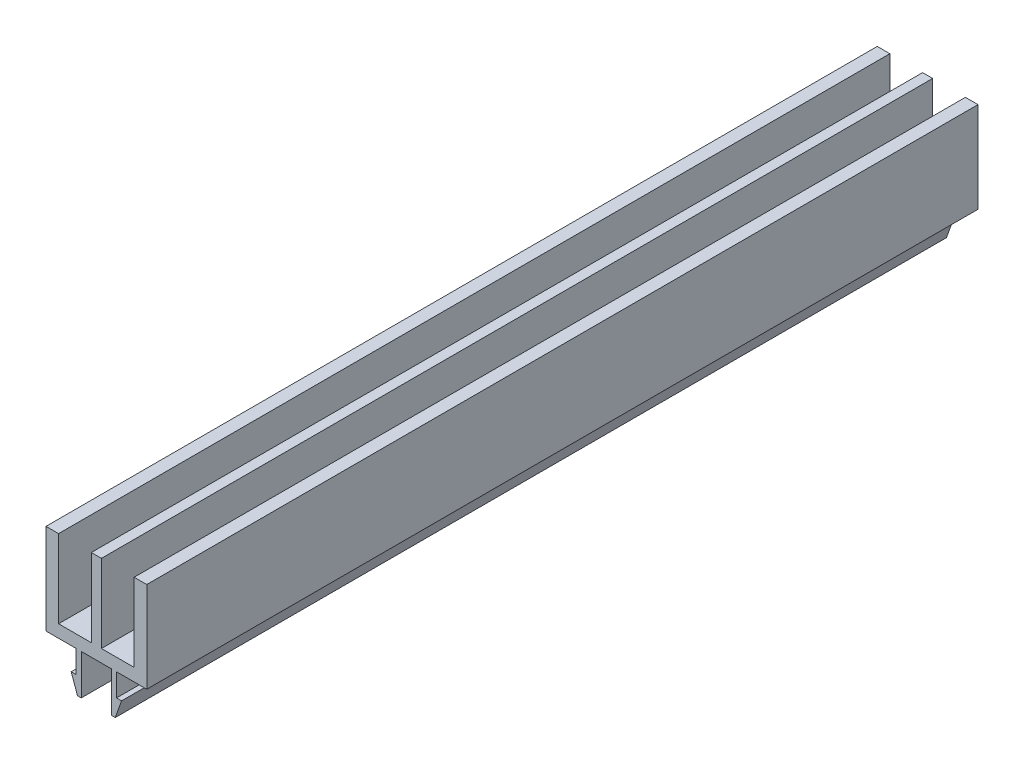
ISO-10303-21;
HEADER;
FILE_DESCRIPTION(('STEP AP214'),'2;1');
FILE_NAME('part.step','',(''),(''),'','','');
FILE_SCHEMA(('AUTOMOTIVE_DESIGN { 1 0 10303 214 1 1 1 1 }'));
ENDSEC;
DATA;
#1=APPLICATION_CONTEXT('core data for automotive mechanical design processes');
#2=APPLICATION_PROTOCOL_DEFINITION('international standard','automotive_design',2000,#1);
#3=PRODUCT_CONTEXT('',#1,'mechanical');
#4=PRODUCT('Part','Part','',(#3));
#5=PRODUCT_RELATED_PRODUCT_CATEGORY('part','',(#4));
#6=PRODUCT_DEFINITION_FORMATION('','',#4);
#7=PRODUCT_DEFINITION_CONTEXT('part definition',#1,'design');
#8=PRODUCT_DEFINITION('design','',#6,#7);
#9=PRODUCT_DEFINITION_SHAPE('','',#8);
#10=(LENGTH_UNIT() NAMED_UNIT(*) SI_UNIT(.MILLI.,.METRE.));
#11=(NAMED_UNIT(*) PLANE_ANGLE_UNIT() SI_UNIT($,.RADIAN.));
#12=(NAMED_UNIT(*) SI_UNIT($,.STERADIAN.) SOLID_ANGLE_UNIT());
#13=UNCERTAINTY_MEASURE_WITH_UNIT(LENGTH_MEASURE(1.E-05),#10,'distance_accuracy_value','');
#14=(GEOMETRIC_REPRESENTATION_CONTEXT(3) GLOBAL_UNCERTAINTY_ASSIGNED_CONTEXT((#13)) GLOBAL_UNIT_ASSIGNED_CONTEXT((#10,
#11,#12)) REPRESENTATION_CONTEXT('',''));
#15=CARTESIAN_POINT('',(0.,0.,0.));
#16=DIRECTION('',(0.,0.,1.));
#17=DIRECTION('',(1.,0.,0.));
#18=AXIS2_PLACEMENT_3D('',#15,#16,#17);
#19=CARTESIAN_POINT('',(-1.,17.9999999975,-115.));
#20=DIRECTION('',(-1.,0.,0.));
#21=DIRECTION('',(0.,-1.,0.));
#22=AXIS2_PLACEMENT_3D('',#19,#20,#21);
#23=PLANE('',#22);
#24=DIRECTION('',(0.,-1.,0.));
#25=VECTOR('',#24,1.);
#26=CARTESIAN_POINT('',(-1.,17.9999999975,50.));
#27=LINE('',#26,#25);
#28=CARTESIAN_POINT('',(-1.,17.9999999975,50.));
#29=VERTEX_POINT('',#28);
#30=CARTESIAN_POINT('',(-1.,2.4999999995,50.));
#31=VERTEX_POINT('',#30);
#32=EDGE_CURVE('E226',#29,#31,#27,.T.);
#33=ORIENTED_EDGE('',*,*,#32,.F.);
#34=DIRECTION('',(0.,0.,1.));
#35=VECTOR('',#34,1.);
#36=CARTESIAN_POINT('',(-1.,17.9999999975,-115.));
#37=LINE('',#36,#35);
#38=CARTESIAN_POINT('',(-1.,17.9999999975,-115.));
#39=VERTEX_POINT('',#38);
#40=EDGE_CURVE('E11',#39,#29,#37,.T.);
#41=ORIENTED_EDGE('',*,*,#40,.F.);
#42=DIRECTION('',(0.,-1.,0.));
#43=VECTOR('',#42,1.);
#44=CARTESIAN_POINT('',(-1.,17.9999999975,-115.));
#45=LINE('',#44,#43);
#46=CARTESIAN_POINT('',(-1.,2.4999999995,-115.));
#47=VERTEX_POINT('',#46);
#48=EDGE_CURVE('E294',#39,#47,#45,.T.);
#49=ORIENTED_EDGE('',*,*,#48,.T.);
#50=DIRECTION('',(0.,0.,1.));
#51=VECTOR('',#50,1.);
#52=CARTESIAN_POINT('',(-1.,2.4999999995,-115.));
#53=LINE('',#52,#51);
#54=EDGE_CURVE('E36',#47,#31,#53,.T.);
#55=ORIENTED_EDGE('',*,*,#54,.T.);
#56=EDGE_LOOP('',(#33,#41,#49,#55));
#57=FACE_BOUND('',#56,.T.);
#58=ADVANCED_FACE('F33',(#57),#23,.T.);
#59=CARTESIAN_POINT('',(0.999999999999998,17.9999999975,-115.));
#60=DIRECTION('',(0.,1.,0.));
#61=DIRECTION('',(0.,0.,1.));
#62=AXIS2_PLACEMENT_3D('',#59,#60,#61);
#63=PLANE('',#62);
#64=DIRECTION('',(-1.,0.,0.));
#65=VECTOR('',#64,1.);
#66=CARTESIAN_POINT('',(0.999999999999998,17.9999999975,50.));
#67=LINE('',#66,#65);
#68=CARTESIAN_POINT('',(0.999999999999998,17.9999999975,50.));
#69=VERTEX_POINT('',#68);
#70=EDGE_CURVE('E292',#69,#29,#67,.T.);
#71=ORIENTED_EDGE('',*,*,#70,.F.);
#72=DIRECTION('',(0.,0.,1.));
#73=VECTOR('',#72,1.);
#74=CARTESIAN_POINT('',(0.999999999999998,17.9999999975,-115.));
#75=LINE('',#74,#73);
#76=CARTESIAN_POINT('',(0.999999999999998,17.9999999975,-115.));
#77=VERTEX_POINT('',#76);
#78=EDGE_CURVE('E42',#77,#69,#75,.T.);
#79=ORIENTED_EDGE('',*,*,#78,.F.);
#80=DIRECTION('',(-1.,0.,0.));
#81=VECTOR('',#80,1.);
#82=CARTESIAN_POINT('',(0.999999999999998,17.9999999975,-115.));
#83=LINE('',#82,#81);
#84=EDGE_CURVE('E216',#77,#39,#83,.T.);
#85=ORIENTED_EDGE('',*,*,#84,.T.);
#86=ORIENTED_EDGE('',*,*,#40,.T.);
#87=EDGE_LOOP('',(#71,#79,#85,#86));
#88=FACE_BOUND('',#87,.T.);
#89=ADVANCED_FACE('F338',(#88),#63,.T.);
#90=CARTESIAN_POINT('',(0.999999999999998,2.4999999995,-115.));
#91=DIRECTION('',(1.,0.,0.));
#92=DIRECTION('',(0.,0.,-1.));
#93=AXIS2_PLACEMENT_3D('',#90,#91,#92);
#94=PLANE('',#93);
#95=DIRECTION('',(0.,1.,0.));
#96=VECTOR('',#95,1.);
#97=CARTESIAN_POINT('',(0.999999999999998,2.4999999995,50.));
#98=LINE('',#97,#96);
#99=CARTESIAN_POINT('',(0.999999999999998,2.4999999995,50.));
#100=VERTEX_POINT('',#99);
#101=EDGE_CURVE('E203',#100,#69,#98,.T.);
#102=ORIENTED_EDGE('',*,*,#101,.F.);
#103=DIRECTION('',(0.,0.,1.));
#104=VECTOR('',#103,1.);
#105=CARTESIAN_POINT('',(0.999999999999998,2.4999999995,-115.));
#106=LINE('',#105,#104);
#107=CARTESIAN_POINT('',(0.999999999999998,2.4999999995,-115.));
#108=VERTEX_POINT('',#107);
#109=EDGE_CURVE('E198',#108,#100,#106,.T.);
#110=ORIENTED_EDGE('',*,*,#109,.F.);
#111=DIRECTION('',(0.,1.,0.));
#112=VECTOR('',#111,1.);
#113=CARTESIAN_POINT('',(0.999999999999998,2.4999999995,-115.));
#114=LINE('',#113,#112);
#115=EDGE_CURVE('E201',#108,#77,#114,.T.);
#116=ORIENTED_EDGE('',*,*,#115,.T.);
#117=ORIENTED_EDGE('',*,*,#78,.T.);
#118=EDGE_LOOP('',(#102,#110,#116,#117));
#119=FACE_BOUND('',#118,.T.);
#120=ADVANCED_FACE('F200',(#119),#94,.T.);
#121=CARTESIAN_POINT('',(7.5,2.4999999995,-115.));
#122=DIRECTION('',(0.,1.,0.));
#123=DIRECTION('',(-1.,0.,0.));
#124=AXIS2_PLACEMENT_3D('',#121,#122,#123);
#125=PLANE('',#124);
#126=DIRECTION('',(-1.,0.,0.));
#127=VECTOR('',#126,1.);
#128=CARTESIAN_POINT('',(7.5,2.4999999995,50.));
#129=LINE('',#128,#127);
#130=CARTESIAN_POINT('',(7.5,2.4999999995,50.));
#131=VERTEX_POINT('',#130);
#132=EDGE_CURVE('E289',#131,#100,#129,.T.);
#133=ORIENTED_EDGE('',*,*,#132,.F.);
#134=DIRECTION('',(0.,0.,1.));
#135=VECTOR('',#134,1.);
#136=CARTESIAN_POINT('',(7.5,2.4999999995,-115.));
#137=LINE('',#136,#135);
#138=CARTESIAN_POINT('',(7.5,2.4999999995,-115.));
#139=VERTEX_POINT('',#138);
#140=EDGE_CURVE('E208',#139,#131,#137,.T.);
#141=ORIENTED_EDGE('',*,*,#140,.F.);
#142=DIRECTION('',(-1.,0.,0.));
#143=VECTOR('',#142,1.);
#144=CARTESIAN_POINT('',(7.5,2.4999999995,-115.));
#145=LINE('',#144,#143);
#146=EDGE_CURVE('E214',#139,#108,#145,.T.);
#147=ORIENTED_EDGE('',*,*,#146,.T.);
#148=ORIENTED_EDGE('',*,*,#109,.T.);
#149=EDGE_LOOP('',(#133,#141,#147,#148));
#150=FACE_BOUND('',#149,.T.);
#151=ADVANCED_FACE('F218',(#150),#125,.T.);
#152=CARTESIAN_POINT('',(7.5,17.9999999975,-115.));
#153=DIRECTION('',(-1.,0.,0.));
#154=DIRECTION('',(0.,-1.,0.));
#155=AXIS2_PLACEMENT_3D('',#152,#153,#154);
#156=PLANE('',#155);
#157=DIRECTION('',(0.,-1.,0.));
#158=VECTOR('',#157,1.);
#159=CARTESIAN_POINT('',(7.5,17.9999999975,50.));
#160=LINE('',#159,#158);
#161=CARTESIAN_POINT('',(7.5,17.9999999975,50.));
#162=VERTEX_POINT('',#161);
#163=EDGE_CURVE('E286',#162,#131,#160,.T.);
#164=ORIENTED_EDGE('',*,*,#163,.F.);
#165=DIRECTION('',(0.,0.,1.));
#166=VECTOR('',#165,1.);
#167=CARTESIAN_POINT('',(7.5,17.9999999975,-115.));
#168=LINE('',#167,#166);
#169=CARTESIAN_POINT('',(7.5,17.9999999975,-115.));
#170=VERTEX_POINT('',#169);
#171=EDGE_CURVE('E298',#170,#162,#168,.T.);
#172=ORIENTED_EDGE('',*,*,#171,.F.);
#173=DIRECTION('',(0.,-1.,0.));
#174=VECTOR('',#173,1.);
#175=CARTESIAN_POINT('',(7.5,17.9999999975,-115.));
#176=LINE('',#175,#174);
#177=EDGE_CURVE('E219',#170,#139,#176,.T.);
#178=ORIENTED_EDGE('',*,*,#177,.T.);
#179=ORIENTED_EDGE('',*,*,#140,.T.);
#180=EDGE_LOOP('',(#164,#172,#178,#179));
#181=FACE_BOUND('',#180,.T.);
#182=ADVANCED_FACE('F351',(#181),#156,.T.);
#183=CARTESIAN_POINT('',(10.,17.9999999975,-115.));
#184=DIRECTION('',(0.,1.,0.));
#185=DIRECTION('',(0.,0.,1.));
#186=AXIS2_PLACEMENT_3D('',#183,#184,#185);
#187=PLANE('',#186);
#188=DIRECTION('',(-1.,0.,0.));
#189=VECTOR('',#188,1.);
#190=CARTESIAN_POINT('',(10.,17.9999999975,50.));
#191=LINE('',#190,#189);
#192=CARTESIAN_POINT('',(10.,17.9999999975,50.));
#193=VERTEX_POINT('',#192);
#194=EDGE_CURVE('E283',#193,#162,#191,.T.);
#195=ORIENTED_EDGE('',*,*,#194,.F.);
#196=DIRECTION('',(0.,0.,1.));
#197=VECTOR('',#196,1.);
#198=CARTESIAN_POINT('',(10.,17.9999999975,-115.));
#199=LINE('',#198,#197);
#200=CARTESIAN_POINT('',(10.,17.9999999975,-115.));
#201=VERTEX_POINT('',#200);
#202=EDGE_CURVE('E300',#201,#193,#199,.T.);
#203=ORIENTED_EDGE('',*,*,#202,.F.);
#204=DIRECTION('',(-1.,0.,0.));
#205=VECTOR('',#204,1.);
#206=CARTESIAN_POINT('',(10.,17.9999999975,-115.));
#207=LINE('',#206,#205);
#208=EDGE_CURVE('E221',#201,#170,#207,.T.);
#209=ORIENTED_EDGE('',*,*,#208,.T.);
#210=ORIENTED_EDGE('',*,*,#171,.T.);
#211=EDGE_LOOP('',(#195,#203,#209,#210));
#212=FACE_BOUND('',#211,.T.);
#213=ADVANCED_FACE('F354',(#212),#187,.T.);
#214=CARTESIAN_POINT('',(10.,-4.99999828349541E-10,-115.));
#215=DIRECTION('',(1.,0.,0.));
#216=DIRECTION('',(0.,0.,-1.));
#217=AXIS2_PLACEMENT_3D('',#214,#215,#216);
#218=PLANE('',#217);
#219=DIRECTION('',(0.,1.,0.));
#220=VECTOR('',#219,1.);
#221=CARTESIAN_POINT('',(10.,-4.99999828349541E-10,50.));
#222=LINE('',#221,#220);
#223=CARTESIAN_POINT('',(10.,-4.99999828349541E-10,50.));
#224=VERTEX_POINT('',#223);
#225=EDGE_CURVE('E280',#224,#193,#222,.T.);
#226=ORIENTED_EDGE('',*,*,#225,.F.);
#227=DIRECTION('',(0.,0.,1.));
#228=VECTOR('',#227,1.);
#229=CARTESIAN_POINT('',(10.,-4.99999828349541E-10,-115.));
#230=LINE('',#229,#228);
#231=CARTESIAN_POINT('',(10.,-4.99999828349541E-10,-115.));
#232=VERTEX_POINT('',#231);
#233=EDGE_CURVE('E302',#232,#224,#230,.T.);
#234=ORIENTED_EDGE('',*,*,#233,.F.);
#235=DIRECTION('',(0.,1.,0.));
#236=VECTOR('',#235,1.);
#237=CARTESIAN_POINT('',(10.,-4.99999828349541E-10,-115.));
#238=LINE('',#237,#236);
#239=EDGE_CURVE('E644',#232,#201,#238,.T.);
#240=ORIENTED_EDGE('',*,*,#239,.T.);
#241=ORIENTED_EDGE('',*,*,#202,.T.);
#242=EDGE_LOOP('',(#226,#234,#240,#241));
#243=FACE_BOUND('',#242,.T.);
#244=ADVANCED_FACE('F358',(#243),#218,.T.);
#245=CARTESIAN_POINT('',(4.,-4.99999998002099E-10,-115.));
#246=DIRECTION('',(0.,-1.,0.));
#247=DIRECTION('',(1.,0.,0.));
#248=AXIS2_PLACEMENT_3D('',#245,#246,#247);
#249=PLANE('',#248);
#250=DIRECTION('',(1.,0.,0.));
#251=VECTOR('',#250,1.);
#252=CARTESIAN_POINT('',(4.,-4.99999998002099E-10,50.));
#253=LINE('',#252,#251);
#254=CARTESIAN_POINT('',(4.,-4.99999998002099E-10,50.));
#255=VERTEX_POINT('',#254);
#256=EDGE_CURVE('E277',#255,#224,#253,.T.);
#257=ORIENTED_EDGE('',*,*,#256,.F.);
#258=DIRECTION('',(0.,0.,1.));
#259=VECTOR('',#258,1.);
#260=CARTESIAN_POINT('',(4.,-4.99999998002099E-10,-115.));
#261=LINE('',#260,#259);
#262=CARTESIAN_POINT('',(4.,-4.99999998002099E-10,-115.));
#263=VERTEX_POINT('',#262);
#264=EDGE_CURVE('E304',#263,#255,#261,.T.);
#265=ORIENTED_EDGE('',*,*,#264,.F.);
#266=DIRECTION('',(1.,0.,0.));
#267=VECTOR('',#266,1.);
#268=CARTESIAN_POINT('',(4.,-4.99999998002099E-10,-115.));
#269=LINE('',#268,#267);
#270=EDGE_CURVE('E648',#263,#232,#269,.T.);
#271=ORIENTED_EDGE('',*,*,#270,.T.);
#272=ORIENTED_EDGE('',*,*,#233,.T.);
#273=EDGE_LOOP('',(#257,#265,#271,#272));
#274=FACE_BOUND('',#273,.T.);
#275=ADVANCED_FACE('F362',(#274),#249,.T.);
#276=CARTESIAN_POINT('',(4.,-4.5,-115.));
#277=DIRECTION('',(1.,0.,0.));
#278=DIRECTION('',(0.,0.,-1.));
#279=AXIS2_PLACEMENT_3D('',#276,#277,#278);
#280=PLANE('',#279);
#281=DIRECTION('',(0.,1.,0.));
#282=VECTOR('',#281,1.);
#283=CARTESIAN_POINT('',(4.,-4.5,50.));
#284=LINE('',#283,#282);
#285=CARTESIAN_POINT('',(4.,-4.5,50.));
#286=VERTEX_POINT('',#285);
#287=EDGE_CURVE('E274',#286,#255,#284,.T.);
#288=ORIENTED_EDGE('',*,*,#287,.F.);
#289=DIRECTION('',(0.,0.,1.));
#290=VECTOR('',#289,1.);
#291=CARTESIAN_POINT('',(4.,-4.5,-115.));
#292=LINE('',#291,#290);
#293=CARTESIAN_POINT('',(4.,-4.5,-115.));
#294=VERTEX_POINT('',#293);
#295=EDGE_CURVE('E306',#294,#286,#292,.T.);
#296=ORIENTED_EDGE('',*,*,#295,.F.);
#297=DIRECTION('',(0.,1.,0.));
#298=VECTOR('',#297,1.);
#299=CARTESIAN_POINT('',(4.,-4.5,-115.));
#300=LINE('',#299,#298);
#301=EDGE_CURVE('E637',#294,#263,#300,.T.);
#302=ORIENTED_EDGE('',*,*,#301,.T.);
#303=ORIENTED_EDGE('',*,*,#264,.T.);
#304=EDGE_LOOP('',(#288,#296,#302,#303));
#305=FACE_BOUND('',#304,.T.);
#306=ADVANCED_FACE('F366',(#305),#280,.T.);
#307=CARTESIAN_POINT('',(5.,-4.5,-115.));
#308=DIRECTION('',(0.,1.,0.));
#309=DIRECTION('',(0.,0.,1.));
#310=AXIS2_PLACEMENT_3D('',#307,#308,#309);
#311=PLANE('',#310);
#312=DIRECTION('',(-1.,0.,0.));
#313=VECTOR('',#312,1.);
#314=CARTESIAN_POINT('',(5.,-4.5,50.));
#315=LINE('',#314,#313);
#316=CARTESIAN_POINT('',(5.,-4.5,50.));
#317=VERTEX_POINT('',#316);
#318=EDGE_CURVE('E271',#317,#286,#315,.T.);
#319=ORIENTED_EDGE('',*,*,#318,.F.);
#320=DIRECTION('',(0.,0.,1.));
#321=VECTOR('',#320,1.);
#322=CARTESIAN_POINT('',(5.,-4.5,-115.));
#323=LINE('',#322,#321);
#324=CARTESIAN_POINT('',(5.,-4.5,-115.));
#325=VERTEX_POINT('',#324);
#326=EDGE_CURVE('E308',#325,#317,#323,.T.);
#327=ORIENTED_EDGE('',*,*,#326,.F.);
#328=DIRECTION('',(-1.,0.,0.));
#329=VECTOR('',#328,1.);
#330=CARTESIAN_POINT('',(5.,-4.5,-115.));
#331=LINE('',#330,#329);
#332=EDGE_CURVE('E633',#325,#294,#331,.T.);
#333=ORIENTED_EDGE('',*,*,#332,.T.);
#334=ORIENTED_EDGE('',*,*,#295,.T.);
#335=EDGE_LOOP('',(#319,#327,#333,#334));
#336=FACE_BOUND('',#335,.T.);
#337=ADVANCED_FACE('F370',(#336),#311,.T.);
#338=CARTESIAN_POINT('',(3.75,-8.,-115.));
#339=DIRECTION('',(0.941741911594837,-0.336336396998157,0.));
#340=DIRECTION('',(0.336336396998157,0.941741911594837,0.));
#341=AXIS2_PLACEMENT_3D('',#338,#339,#340);
#342=PLANE('',#341);
#343=DIRECTION('',(0.336336396998157,0.941741911594837,0.));
#344=VECTOR('',#343,1.);
#345=CARTESIAN_POINT('',(3.75,-8.,50.));
#346=LINE('',#345,#344);
#347=CARTESIAN_POINT('',(3.75,-8.,50.));
#348=VERTEX_POINT('',#347);
#349=EDGE_CURVE('E268',#348,#317,#346,.T.);
#350=ORIENTED_EDGE('',*,*,#349,.F.);
#351=DIRECTION('',(0.,0.,1.));
#352=VECTOR('',#351,1.);
#353=CARTESIAN_POINT('',(3.75,-8.,-115.));
#354=LINE('',#353,#352);
#355=CARTESIAN_POINT('',(3.75,-8.,-115.));
#356=VERTEX_POINT('',#355);
#357=EDGE_CURVE('E310',#356,#348,#354,.T.);
#358=ORIENTED_EDGE('',*,*,#357,.F.);
#359=DIRECTION('',(0.336336396998157,0.941741911594837,0.));
#360=VECTOR('',#359,1.);
#361=CARTESIAN_POINT('',(3.75,-8.,-115.));
#362=LINE('',#361,#360);
#363=EDGE_CURVE('E654',#356,#325,#362,.T.);
#364=ORIENTED_EDGE('',*,*,#363,.T.);
#365=ORIENTED_EDGE('',*,*,#326,.T.);
#366=EDGE_LOOP('',(#350,#358,#364,#365));
#367=FACE_BOUND('',#366,.T.);
#368=ADVANCED_FACE('F374',(#367),#342,.T.);
#369=CARTESIAN_POINT('',(3.,-8.,-115.));
#370=DIRECTION('',(0.,-1.,0.));
#371=DIRECTION('',(0.,0.,-1.));
#372=AXIS2_PLACEMENT_3D('',#369,#370,#371);
#373=PLANE('',#372);
#374=DIRECTION('',(1.,0.,0.));
#375=VECTOR('',#374,1.);
#376=CARTESIAN_POINT('',(3.,-8.,50.));
#377=LINE('',#376,#375);
#378=CARTESIAN_POINT('',(3.,-8.,50.));
#379=VERTEX_POINT('',#378);
#380=EDGE_CURVE('E265',#379,#348,#377,.T.);
#381=ORIENTED_EDGE('',*,*,#380,.F.);
#382=DIRECTION('',(0.,0.,1.));
#383=VECTOR('',#382,1.);
#384=CARTESIAN_POINT('',(3.,-8.,-115.));
#385=LINE('',#384,#383);
#386=CARTESIAN_POINT('',(3.,-8.,-115.));
#387=VERTEX_POINT('',#386);
#388=EDGE_CURVE('E312',#387,#379,#385,.T.);
#389=ORIENTED_EDGE('',*,*,#388,.F.);
#390=DIRECTION('',(1.,0.,0.));
#391=VECTOR('',#390,1.);
#392=CARTESIAN_POINT('',(3.,-8.,-115.));
#393=LINE('',#392,#391);
#394=EDGE_CURVE('E626',#387,#356,#393,.T.);
#395=ORIENTED_EDGE('',*,*,#394,.T.);
#396=ORIENTED_EDGE('',*,*,#357,.T.);
#397=EDGE_LOOP('',(#381,#389,#395,#396));
#398=FACE_BOUND('',#397,.T.);
#399=ADVANCED_FACE('F378',(#398),#373,.T.);
#400=CARTESIAN_POINT('',(3.,-4.9999985194348E-10,-115.));
#401=DIRECTION('',(-1.,0.,0.));
#402=DIRECTION('',(0.,0.,1.));
#403=AXIS2_PLACEMENT_3D('',#400,#401,#402);
#404=PLANE('',#403);
#405=DIRECTION('',(0.,-1.,0.));
#406=VECTOR('',#405,1.);
#407=CARTESIAN_POINT('',(3.,-4.9999985194348E-10,50.));
#408=LINE('',#407,#406);
#409=CARTESIAN_POINT('',(3.,-4.9999985194348E-10,50.));
#410=VERTEX_POINT('',#409);
#411=EDGE_CURVE('E262',#410,#379,#408,.T.);
#412=ORIENTED_EDGE('',*,*,#411,.F.);
#413=DIRECTION('',(0.,0.,1.));
#414=VECTOR('',#413,1.);
#415=CARTESIAN_POINT('',(3.,-4.9999985194348E-10,-115.));
#416=LINE('',#415,#414);
#417=CARTESIAN_POINT('',(3.,-4.9999985194348E-10,-115.));
#418=VERTEX_POINT('',#417);
#419=EDGE_CURVE('E314',#418,#410,#416,.T.);
#420=ORIENTED_EDGE('',*,*,#419,.F.);
#421=DIRECTION('',(0.,-1.,0.));
#422=VECTOR('',#421,1.);
#423=CARTESIAN_POINT('',(3.,-4.9999985194348E-10,-115.));
#424=LINE('',#423,#422);
#425=EDGE_CURVE('E622',#418,#387,#424,.T.);
#426=ORIENTED_EDGE('',*,*,#425,.T.);
#427=ORIENTED_EDGE('',*,*,#388,.T.);
#428=EDGE_LOOP('',(#412,#420,#426,#427));
#429=FACE_BOUND('',#428,.T.);
#430=ADVANCED_FACE('F382',(#429),#404,.T.);
#431=CARTESIAN_POINT('',(-3.,-4.99999455901012E-10,-115.));
#432=DIRECTION('',(0.,-1.,0.));
#433=DIRECTION('',(1.,0.,0.));
#434=AXIS2_PLACEMENT_3D('',#431,#432,#433);
#435=PLANE('',#434);
#436=DIRECTION('',(1.,0.,0.));
#437=VECTOR('',#436,1.);
#438=CARTESIAN_POINT('',(-3.,-4.99999455901012E-10,50.));
#439=LINE('',#438,#437);
#440=CARTESIAN_POINT('',(-3.,-4.99999455901012E-10,50.));
#441=VERTEX_POINT('',#440);
#442=EDGE_CURVE('E259',#441,#410,#439,.T.);
#443=ORIENTED_EDGE('',*,*,#442,.F.);
#444=DIRECTION('',(0.,0.,1.));
#445=VECTOR('',#444,1.);
#446=CARTESIAN_POINT('',(-3.,-4.99999455901012E-10,-115.));
#447=LINE('',#446,#445);
#448=CARTESIAN_POINT('',(-3.,-4.99999455901012E-10,-115.));
#449=VERTEX_POINT('',#448);
#450=EDGE_CURVE('E316',#449,#441,#447,.T.);
#451=ORIENTED_EDGE('',*,*,#450,.F.);
#452=DIRECTION('',(1.,0.,0.));
#453=VECTOR('',#452,1.);
#454=CARTESIAN_POINT('',(-3.,-4.99999455901012E-10,-115.));
#455=LINE('',#454,#453);
#456=EDGE_CURVE('E658',#449,#418,#455,.T.);
#457=ORIENTED_EDGE('',*,*,#456,.T.);
#458=ORIENTED_EDGE('',*,*,#419,.T.);
#459=EDGE_LOOP('',(#443,#451,#457,#458));
#460=FACE_BOUND('',#459,.T.);
#461=ADVANCED_FACE('F386',(#460),#435,.T.);
#462=CARTESIAN_POINT('',(-3.,-8.,-115.));
#463=DIRECTION('',(1.,0.,0.));
#464=DIRECTION('',(0.,0.,-1.));
#465=AXIS2_PLACEMENT_3D('',#462,#463,#464);
#466=PLANE('',#465);
#467=DIRECTION('',(0.,1.,0.));
#468=VECTOR('',#467,1.);
#469=CARTESIAN_POINT('',(-3.,-8.,50.));
#470=LINE('',#469,#468);
#471=CARTESIAN_POINT('',(-3.,-8.,50.));
#472=VERTEX_POINT('',#471);
#473=EDGE_CURVE('E256',#472,#441,#470,.T.);
#474=ORIENTED_EDGE('',*,*,#473,.F.);
#475=DIRECTION('',(0.,0.,1.));
#476=VECTOR('',#475,1.);
#477=CARTESIAN_POINT('',(-3.,-8.,-115.));
#478=LINE('',#477,#476);
#479=CARTESIAN_POINT('',(-3.,-8.,-115.));
#480=VERTEX_POINT('',#479);
#481=EDGE_CURVE('E318',#480,#472,#478,.T.);
#482=ORIENTED_EDGE('',*,*,#481,.F.);
#483=DIRECTION('',(0.,1.,0.));
#484=VECTOR('',#483,1.);
#485=CARTESIAN_POINT('',(-3.,-8.,-115.));
#486=LINE('',#485,#484);
#487=EDGE_CURVE('E615',#480,#449,#486,.T.);
#488=ORIENTED_EDGE('',*,*,#487,.T.);
#489=ORIENTED_EDGE('',*,*,#450,.T.);
#490=EDGE_LOOP('',(#474,#482,#488,#489));
#491=FACE_BOUND('',#490,.T.);
#492=ADVANCED_FACE('F390',(#491),#466,.T.);
#493=CARTESIAN_POINT('',(-3.75,-8.,-115.));
#494=DIRECTION('',(0.,-1.,0.));
#495=DIRECTION('',(0.,0.,-1.));
#496=AXIS2_PLACEMENT_3D('',#493,#494,#495);
#497=PLANE('',#496);
#498=DIRECTION('',(1.,0.,0.));
#499=VECTOR('',#498,1.);
#500=CARTESIAN_POINT('',(-3.75,-8.,50.));
#501=LINE('',#500,#499);
#502=CARTESIAN_POINT('',(-3.75,-8.,50.));
#503=VERTEX_POINT('',#502);
#504=EDGE_CURVE('E253',#503,#472,#501,.T.);
#505=ORIENTED_EDGE('',*,*,#504,.F.);
#506=DIRECTION('',(0.,0.,1.));
#507=VECTOR('',#506,1.);
#508=CARTESIAN_POINT('',(-3.75,-8.,-115.));
#509=LINE('',#508,#507);
#510=CARTESIAN_POINT('',(-3.75,-8.,-115.));
#511=VERTEX_POINT('',#510);
#512=EDGE_CURVE('E320',#511,#503,#509,.T.);
#513=ORIENTED_EDGE('',*,*,#512,.F.);
#514=DIRECTION('',(1.,0.,0.));
#515=VECTOR('',#514,1.);
#516=CARTESIAN_POINT('',(-3.75,-8.,-115.));
#517=LINE('',#516,#515);
#518=EDGE_CURVE('E611',#511,#480,#517,.T.);
#519=ORIENTED_EDGE('',*,*,#518,.T.);
#520=ORIENTED_EDGE('',*,*,#481,.T.);
#521=EDGE_LOOP('',(#505,#513,#519,#520));
#522=FACE_BOUND('',#521,.T.);
#523=ADVANCED_FACE('F394',(#522),#497,.T.);
#524=CARTESIAN_POINT('',(-5.,-4.5,-115.));
#525=DIRECTION('',(-0.941741911594837,-0.336336396998156,0.));
#526=DIRECTION('',(0.336336396998156,-0.941741911594837,0.));
#527=AXIS2_PLACEMENT_3D('',#524,#525,#526);
#528=PLANE('',#527);
#529=DIRECTION('',(0.336336396998156,-0.941741911594837,0.));
#530=VECTOR('',#529,1.);
#531=CARTESIAN_POINT('',(-5.,-4.5,50.));
#532=LINE('',#531,#530);
#533=CARTESIAN_POINT('',(-5.,-4.5,50.));
#534=VERTEX_POINT('',#533);
#535=EDGE_CURVE('E250',#534,#503,#532,.T.);
#536=ORIENTED_EDGE('',*,*,#535,.F.);
#537=DIRECTION('',(0.,0.,1.));
#538=VECTOR('',#537,1.);
#539=CARTESIAN_POINT('',(-5.,-4.5,-115.));
#540=LINE('',#539,#538);
#541=CARTESIAN_POINT('',(-5.,-4.5,-115.));
#542=VERTEX_POINT('',#541);
#543=EDGE_CURVE('E322',#542,#534,#540,.T.);
#544=ORIENTED_EDGE('',*,*,#543,.F.);
#545=DIRECTION('',(0.336336396998156,-0.941741911594837,0.));
#546=VECTOR('',#545,1.);
#547=CARTESIAN_POINT('',(-5.,-4.5,-115.));
#548=LINE('',#547,#546);
#549=EDGE_CURVE('E662',#542,#511,#548,.T.);
#550=ORIENTED_EDGE('',*,*,#549,.T.);
#551=ORIENTED_EDGE('',*,*,#512,.T.);
#552=EDGE_LOOP('',(#536,#544,#550,#551));
#553=FACE_BOUND('',#552,.T.);
#554=ADVANCED_FACE('F398',(#553),#528,.T.);
#555=CARTESIAN_POINT('',(-4.,-4.5,-115.));
#556=DIRECTION('',(0.,1.,0.));
#557=DIRECTION('',(0.,0.,1.));
#558=AXIS2_PLACEMENT_3D('',#555,#556,#557);
#559=PLANE('',#558);
#560=DIRECTION('',(-1.,0.,0.));
#561=VECTOR('',#560,1.);
#562=CARTESIAN_POINT('',(-4.,-4.5,50.));
#563=LINE('',#562,#561);
#564=CARTESIAN_POINT('',(-4.,-4.5,50.));
#565=VERTEX_POINT('',#564);
#566=EDGE_CURVE('E247',#565,#534,#563,.T.);
#567=ORIENTED_EDGE('',*,*,#566,.F.);
#568=DIRECTION('',(0.,0.,1.));
#569=VECTOR('',#568,1.);
#570=CARTESIAN_POINT('',(-4.,-4.5,-115.));
#571=LINE('',#570,#569);
#572=CARTESIAN_POINT('',(-4.,-4.5,-115.));
#573=VERTEX_POINT('',#572);
#574=EDGE_CURVE('E324',#573,#565,#571,.T.);
#575=ORIENTED_EDGE('',*,*,#574,.F.);
#576=DIRECTION('',(-1.,0.,0.));
#577=VECTOR('',#576,1.);
#578=CARTESIAN_POINT('',(-4.,-4.5,-115.));
#579=LINE('',#578,#577);
#580=EDGE_CURVE('E604',#573,#542,#579,.T.);
#581=ORIENTED_EDGE('',*,*,#580,.T.);
#582=ORIENTED_EDGE('',*,*,#543,.T.);
#583=EDGE_LOOP('',(#567,#575,#581,#582));
#584=FACE_BOUND('',#583,.T.);
#585=ADVANCED_FACE('F402',(#584),#559,.T.);
#586=CARTESIAN_POINT('',(-4.,-4.9999985194348E-10,-115.));
#587=DIRECTION('',(-1.,0.,0.));
#588=DIRECTION('',(0.,0.,1.));
#589=AXIS2_PLACEMENT_3D('',#586,#587,#588);
#590=PLANE('',#589);
#591=DIRECTION('',(0.,-1.,0.));
#592=VECTOR('',#591,1.);
#593=CARTESIAN_POINT('',(-4.,-4.9999985194348E-10,50.));
#594=LINE('',#593,#592);
#595=CARTESIAN_POINT('',(-4.,-4.9999985194348E-10,50.));
#596=VERTEX_POINT('',#595);
#597=EDGE_CURVE('E244',#596,#565,#594,.T.);
#598=ORIENTED_EDGE('',*,*,#597,.F.);
#599=DIRECTION('',(0.,0.,1.));
#600=VECTOR('',#599,1.);
#601=CARTESIAN_POINT('',(-4.,-4.9999985194348E-10,-115.));
#602=LINE('',#601,#600);
#603=CARTESIAN_POINT('',(-4.,-4.9999985194348E-10,-115.));
#604=VERTEX_POINT('',#603);
#605=EDGE_CURVE('E326',#604,#596,#602,.T.);
#606=ORIENTED_EDGE('',*,*,#605,.F.);
#607=DIRECTION('',(0.,-1.,0.));
#608=VECTOR('',#607,1.);
#609=CARTESIAN_POINT('',(-4.,-4.9999985194348E-10,-115.));
#610=LINE('',#609,#608);
#611=EDGE_CURVE('E600',#604,#573,#610,.T.);
#612=ORIENTED_EDGE('',*,*,#611,.T.);
#613=ORIENTED_EDGE('',*,*,#574,.T.);
#614=EDGE_LOOP('',(#598,#606,#612,#613));
#615=FACE_BOUND('',#614,.T.);
#616=ADVANCED_FACE('F406',(#615),#590,.T.);
#617=CARTESIAN_POINT('',(-10.,-4.99999719929324E-10,-115.));
#618=DIRECTION('',(0.,-1.,0.));
#619=DIRECTION('',(1.,0.,0.));
#620=AXIS2_PLACEMENT_3D('',#617,#618,#619);
#621=PLANE('',#620);
#622=DIRECTION('',(1.,0.,0.));
#623=VECTOR('',#622,1.);
#624=CARTESIAN_POINT('',(-10.,-4.99999719929324E-10,50.));
#625=LINE('',#624,#623);
#626=CARTESIAN_POINT('',(-10.,-4.99999719929324E-10,50.));
#627=VERTEX_POINT('',#626);
#628=EDGE_CURVE('E241',#627,#596,#625,.T.);
#629=ORIENTED_EDGE('',*,*,#628,.F.);
#630=DIRECTION('',(0.,0.,1.));
#631=VECTOR('',#630,1.);
#632=CARTESIAN_POINT('',(-10.,-4.99999719929324E-10,-115.));
#633=LINE('',#632,#631);
#634=CARTESIAN_POINT('',(-10.,-4.99999719929324E-10,-115.));
#635=VERTEX_POINT('',#634);
#636=EDGE_CURVE('E328',#635,#627,#633,.T.);
#637=ORIENTED_EDGE('',*,*,#636,.F.);
#638=DIRECTION('',(1.,0.,0.));
#639=VECTOR('',#638,1.);
#640=CARTESIAN_POINT('',(-10.,-4.99999719929324E-10,-115.));
#641=LINE('',#640,#639);
#642=EDGE_CURVE('E666',#635,#604,#641,.T.);
#643=ORIENTED_EDGE('',*,*,#642,.T.);
#644=ORIENTED_EDGE('',*,*,#605,.T.);
#645=EDGE_LOOP('',(#629,#637,#643,#644));
#646=FACE_BOUND('',#645,.T.);
#647=ADVANCED_FACE('F410',(#646),#621,.T.);
#648=CARTESIAN_POINT('',(-10.,17.9999999975,-115.));
#649=DIRECTION('',(-1.,0.,0.));
#650=DIRECTION('',(0.,-1.,0.));
#651=AXIS2_PLACEMENT_3D('',#648,#649,#650);
#652=PLANE('',#651);
#653=DIRECTION('',(0.,-1.,0.));
#654=VECTOR('',#653,1.);
#655=CARTESIAN_POINT('',(-10.,17.9999999975,50.));
#656=LINE('',#655,#654);
#657=CARTESIAN_POINT('',(-10.,17.9999999975,50.));
#658=VERTEX_POINT('',#657);
#659=EDGE_CURVE('E238',#658,#627,#656,.T.);
#660=ORIENTED_EDGE('',*,*,#659,.F.);
#661=DIRECTION('',(0.,0.,1.));
#662=VECTOR('',#661,1.);
#663=CARTESIAN_POINT('',(-10.,17.9999999975,-115.));
#664=LINE('',#663,#662);
#665=CARTESIAN_POINT('',(-10.,17.9999999975,-115.));
#666=VERTEX_POINT('',#665);
#667=EDGE_CURVE('E330',#666,#658,#664,.T.);
#668=ORIENTED_EDGE('',*,*,#667,.F.);
#669=DIRECTION('',(0.,-1.,0.));
#670=VECTOR('',#669,1.);
#671=CARTESIAN_POINT('',(-10.,17.9999999975,-115.));
#672=LINE('',#671,#670);
#673=EDGE_CURVE('E593',#666,#635,#672,.T.);
#674=ORIENTED_EDGE('',*,*,#673,.T.);
#675=ORIENTED_EDGE('',*,*,#636,.T.);
#676=EDGE_LOOP('',(#660,#668,#674,#675));
#677=FACE_BOUND('',#676,.T.);
#678=ADVANCED_FACE('F414',(#677),#652,.T.);
#679=CARTESIAN_POINT('',(-7.5,17.9999999975,-115.));
#680=DIRECTION('',(0.,1.,0.));
#681=DIRECTION('',(0.,0.,1.));
#682=AXIS2_PLACEMENT_3D('',#679,#680,#681);
#683=PLANE('',#682);
#684=DIRECTION('',(-1.,0.,0.));
#685=VECTOR('',#684,1.);
#686=CARTESIAN_POINT('',(-7.5,17.9999999975,50.));
#687=LINE('',#686,#685);
#688=CARTESIAN_POINT('',(-7.5,17.9999999975,50.));
#689=VERTEX_POINT('',#688);
#690=EDGE_CURVE('E235',#689,#658,#687,.T.);
#691=ORIENTED_EDGE('',*,*,#690,.F.);
#692=DIRECTION('',(0.,0.,1.));
#693=VECTOR('',#692,1.);
#694=CARTESIAN_POINT('',(-7.5,17.9999999975,-115.));
#695=LINE('',#694,#693);
#696=CARTESIAN_POINT('',(-7.5,17.9999999975,-115.));
#697=VERTEX_POINT('',#696);
#698=EDGE_CURVE('E332',#697,#689,#695,.T.);
#699=ORIENTED_EDGE('',*,*,#698,.F.);
#700=DIRECTION('',(-1.,0.,0.));
#701=VECTOR('',#700,1.);
#702=CARTESIAN_POINT('',(-7.5,17.9999999975,-115.));
#703=LINE('',#702,#701);
#704=EDGE_CURVE('E589',#697,#666,#703,.T.);
#705=ORIENTED_EDGE('',*,*,#704,.T.);
#706=ORIENTED_EDGE('',*,*,#667,.T.);
#707=EDGE_LOOP('',(#691,#699,#705,#706));
#708=FACE_BOUND('',#707,.T.);
#709=ADVANCED_FACE('F418',(#708),#683,.T.);
#710=CARTESIAN_POINT('',(-7.5,2.4999999995,-115.));
#711=DIRECTION('',(1.,0.,0.));
#712=DIRECTION('',(0.,0.,-1.));
#713=AXIS2_PLACEMENT_3D('',#710,#711,#712);
#714=PLANE('',#713);
#715=DIRECTION('',(0.,1.,0.));
#716=VECTOR('',#715,1.);
#717=CARTESIAN_POINT('',(-7.5,2.4999999995,50.));
#718=LINE('',#717,#716);
#719=CARTESIAN_POINT('',(-7.5,2.4999999995,50.));
#720=VERTEX_POINT('',#719);
#721=EDGE_CURVE('E232',#720,#689,#718,.T.);
#722=ORIENTED_EDGE('',*,*,#721,.F.);
#723=DIRECTION('',(0.,0.,1.));
#724=VECTOR('',#723,1.);
#725=CARTESIAN_POINT('',(-7.5,2.4999999995,-115.));
#726=LINE('',#725,#724);
#727=CARTESIAN_POINT('',(-7.5,2.4999999995,-115.));
#728=VERTEX_POINT('',#727);
#729=EDGE_CURVE('E333',#728,#720,#726,.T.);
#730=ORIENTED_EDGE('',*,*,#729,.F.);
#731=DIRECTION('',(0.,1.,0.));
#732=VECTOR('',#731,1.);
#733=CARTESIAN_POINT('',(-7.5,2.4999999995,-115.));
#734=LINE('',#733,#732);
#735=EDGE_CURVE('E670',#728,#697,#734,.T.);
#736=ORIENTED_EDGE('',*,*,#735,.T.);
#737=ORIENTED_EDGE('',*,*,#698,.T.);
#738=EDGE_LOOP('',(#722,#730,#736,#737));
#739=FACE_BOUND('',#738,.T.);
#740=ADVANCED_FACE('F422',(#739),#714,.T.);
#741=CARTESIAN_POINT('',(-1.,2.4999999995,-115.));
#742=DIRECTION('',(0.,1.,0.));
#743=DIRECTION('',(-1.,0.,0.));
#744=AXIS2_PLACEMENT_3D('',#741,#742,#743);
#745=PLANE('',#744);
#746=DIRECTION('',(-1.,0.,0.));
#747=VECTOR('',#746,1.);
#748=CARTESIAN_POINT('',(-1.,2.4999999995,50.));
#749=LINE('',#748,#747);
#750=EDGE_CURVE('E229',#31,#720,#749,.T.);
#751=ORIENTED_EDGE('',*,*,#750,.F.);
#752=ORIENTED_EDGE('',*,*,#54,.F.);
#753=DIRECTION('',(-1.,0.,0.));
#754=VECTOR('',#753,1.);
#755=CARTESIAN_POINT('',(-1.,2.4999999995,-115.));
#756=LINE('',#755,#754);
#757=EDGE_CURVE('E672',#47,#728,#756,.T.);
#758=ORIENTED_EDGE('',*,*,#757,.T.);
#759=ORIENTED_EDGE('',*,*,#729,.T.);
#760=EDGE_LOOP('',(#751,#752,#758,#759));
#761=FACE_BOUND('',#760,.T.);
#762=ADVANCED_FACE('F335',(#761),#745,.T.);
#763=CARTESIAN_POINT('',(0.,0.,-115.));
#764=DIRECTION('',(0.,0.,-1.));
#765=DIRECTION('',(-1.,0.,0.));
#766=AXIS2_PLACEMENT_3D('',#763,#764,#765);
#767=PLANE('',#766);
#768=ORIENTED_EDGE('',*,*,#48,.F.);
#769=ORIENTED_EDGE('',*,*,#84,.F.);
#770=ORIENTED_EDGE('',*,*,#115,.F.);
#771=ORIENTED_EDGE('',*,*,#146,.F.);
#772=ORIENTED_EDGE('',*,*,#177,.F.);
#773=ORIENTED_EDGE('',*,*,#208,.F.);
#774=ORIENTED_EDGE('',*,*,#239,.F.);
#775=ORIENTED_EDGE('',*,*,#270,.F.);
#776=ORIENTED_EDGE('',*,*,#301,.F.);
#777=ORIENTED_EDGE('',*,*,#332,.F.);
#778=ORIENTED_EDGE('',*,*,#363,.F.);
#779=ORIENTED_EDGE('',*,*,#394,.F.);
#780=ORIENTED_EDGE('',*,*,#425,.F.);
#781=ORIENTED_EDGE('',*,*,#456,.F.);
#782=ORIENTED_EDGE('',*,*,#487,.F.);
#783=ORIENTED_EDGE('',*,*,#518,.F.);
#784=ORIENTED_EDGE('',*,*,#549,.F.);
#785=ORIENTED_EDGE('',*,*,#580,.F.);
#786=ORIENTED_EDGE('',*,*,#611,.F.);
#787=ORIENTED_EDGE('',*,*,#642,.F.);
#788=ORIENTED_EDGE('',*,*,#673,.F.);
#789=ORIENTED_EDGE('',*,*,#704,.F.);
#790=ORIENTED_EDGE('',*,*,#735,.F.);
#791=ORIENTED_EDGE('',*,*,#757,.F.);
#792=EDGE_LOOP('',(#768,#769,#770,#771,#772,#773,#774,#775,#776,#777,#778,#779,#780,#781,#782,
#783,#784,#785,#786,#787,#788,#789,#790,#791));
#793=FACE_BOUND('',#792,.T.);
#794=ADVANCED_FACE('F212',(#793),#767,.T.);
#795=CARTESIAN_POINT('',(0.,0.,50.));
#796=DIRECTION('',(0.,0.,-1.));
#797=DIRECTION('',(-1.,0.,0.));
#798=AXIS2_PLACEMENT_3D('',#795,#796,#797);
#799=PLANE('',#798);
#800=ORIENTED_EDGE('',*,*,#32,.T.);
#801=ORIENTED_EDGE('',*,*,#750,.T.);
#802=ORIENTED_EDGE('',*,*,#721,.T.);
#803=ORIENTED_EDGE('',*,*,#690,.T.);
#804=ORIENTED_EDGE('',*,*,#659,.T.);
#805=ORIENTED_EDGE('',*,*,#628,.T.);
#806=ORIENTED_EDGE('',*,*,#597,.T.);
#807=ORIENTED_EDGE('',*,*,#566,.T.);
#808=ORIENTED_EDGE('',*,*,#535,.T.);
#809=ORIENTED_EDGE('',*,*,#504,.T.);
#810=ORIENTED_EDGE('',*,*,#473,.T.);
#811=ORIENTED_EDGE('',*,*,#442,.T.);
#812=ORIENTED_EDGE('',*,*,#411,.T.);
#813=ORIENTED_EDGE('',*,*,#380,.T.);
#814=ORIENTED_EDGE('',*,*,#349,.T.);
#815=ORIENTED_EDGE('',*,*,#318,.T.);
#816=ORIENTED_EDGE('',*,*,#287,.T.);
#817=ORIENTED_EDGE('',*,*,#256,.T.);
#818=ORIENTED_EDGE('',*,*,#225,.T.);
#819=ORIENTED_EDGE('',*,*,#194,.T.);
#820=ORIENTED_EDGE('',*,*,#163,.T.);
#821=ORIENTED_EDGE('',*,*,#132,.T.);
#822=ORIENTED_EDGE('',*,*,#101,.T.);
#823=ORIENTED_EDGE('',*,*,#70,.T.);
#824=EDGE_LOOP('',(#800,#801,#802,#803,#804,#805,#806,#807,#808,#809,#810,#811,#812,#813,#814,
#815,#816,#817,#818,#819,#820,#821,#822,#823));
#825=FACE_BOUND('',#824,.T.);
#826=ADVANCED_FACE('F337',(#825),#799,.F.);
#827=CLOSED_SHELL('',(#58,#89,#120,#151,#182,#213,#244,#275,#306,#337,#368,#399,#430,#461,#492,
#523,#554,#585,#616,#647,#678,#709,#740,#762,#794,#826));
#828=MANIFOLD_SOLID_BREP('B2',#827);
#829=ADVANCED_BREP_SHAPE_REPRESENTATION('',(#18,#828),#14);
#830=SHAPE_DEFINITION_REPRESENTATION(#9,#829);
ENDSEC;
END-ISO-10303-21;
